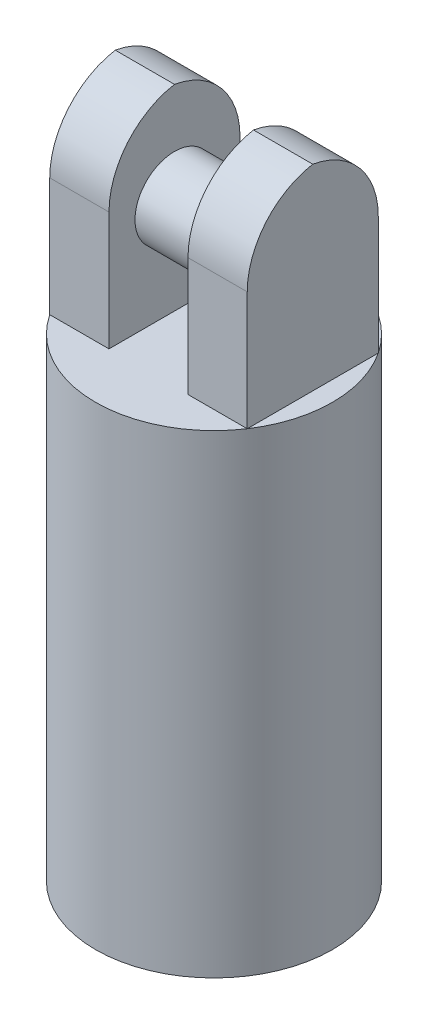
ISO-10303-21;
HEADER;
FILE_DESCRIPTION(('STEP AP214'),'2;1');
FILE_NAME('part.step','',(''),(''),'','','');
FILE_SCHEMA(('AUTOMOTIVE_DESIGN { 1 0 10303 214 1 1 1 1 }'));
ENDSEC;
DATA;
#1=APPLICATION_CONTEXT('core data for automotive mechanical design processes');
#2=APPLICATION_PROTOCOL_DEFINITION('international standard','automotive_design',2000,#1);
#3=PRODUCT_CONTEXT('',#1,'mechanical');
#4=PRODUCT('Part','Part','',(#3));
#5=PRODUCT_RELATED_PRODUCT_CATEGORY('part','',(#4));
#6=PRODUCT_DEFINITION_FORMATION('','',#4);
#7=PRODUCT_DEFINITION_CONTEXT('part definition',#1,'design');
#8=PRODUCT_DEFINITION('design','',#6,#7);
#9=PRODUCT_DEFINITION_SHAPE('','',#8);
#10=(LENGTH_UNIT() NAMED_UNIT(*) SI_UNIT(.MILLI.,.METRE.));
#11=(NAMED_UNIT(*) PLANE_ANGLE_UNIT() SI_UNIT($,.RADIAN.));
#12=(NAMED_UNIT(*) SI_UNIT($,.STERADIAN.) SOLID_ANGLE_UNIT());
#13=UNCERTAINTY_MEASURE_WITH_UNIT(LENGTH_MEASURE(1.E-05),#10,'distance_accuracy_value','');
#14=(GEOMETRIC_REPRESENTATION_CONTEXT(3) GLOBAL_UNCERTAINTY_ASSIGNED_CONTEXT((#13)) GLOBAL_UNIT_ASSIGNED_CONTEXT((#10,
#11,#12)) REPRESENTATION_CONTEXT('',''));
#15=CARTESIAN_POINT('',(0.,0.,0.));
#16=DIRECTION('',(0.,0.,1.));
#17=DIRECTION('',(1.,0.,0.));
#18=AXIS2_PLACEMENT_3D('',#15,#16,#17);
#19=CARTESIAN_POINT('',(-31.75,215.9,-21.0605674187568));
#20=DIRECTION('',(0.,0.,1.));
#21=DIRECTION('',(1.,0.,0.));
#22=AXIS2_PLACEMENT_3D('',#19,#20,#21);
#23=PLANE('',#22);
#24=DIRECTION('',(0.,1.,0.));
#25=VECTOR('',#24,1.);
#26=CARTESIAN_POINT('',(12.7,152.4,-21.0605674187568));
#27=LINE('',#26,#25);
#28=CARTESIAN_POINT('',(12.7,152.4,-21.0605674187568));
#29=VERTEX_POINT('',#28);
#30=CARTESIAN_POINT('',(12.7,190.5,-21.0605674187568));
#31=VERTEX_POINT('',#30);
#32=EDGE_CURVE('E120',#29,#31,#27,.T.);
#33=ORIENTED_EDGE('',*,*,#32,.T.);
#34=DIRECTION('',(-1.,0.,0.));
#35=VECTOR('',#34,1.);
#36=CARTESIAN_POINT('',(-31.75,190.5,-21.0605674187568));
#37=LINE('',#36,#35);
#38=CARTESIAN_POINT('',(31.75,190.5,-21.0605674187568));
#39=VERTEX_POINT('',#38);
#40=EDGE_CURVE('E211',#31,#39,#37,.F.);
#41=ORIENTED_EDGE('',*,*,#40,.T.);
#42=DIRECTION('',(0.,-1.,0.));
#43=VECTOR('',#42,1.);
#44=CARTESIAN_POINT('',(31.75,215.9,-21.0605674187568));
#45=LINE('',#44,#43);
#46=CARTESIAN_POINT('',(31.75,152.4,-21.0605674187568));
#47=VERTEX_POINT('',#46);
#48=EDGE_CURVE('E149',#39,#47,#45,.T.);
#49=ORIENTED_EDGE('',*,*,#48,.T.);
#50=DIRECTION('',(-1.,0.,0.));
#51=VECTOR('',#50,1.);
#52=CARTESIAN_POINT('',(-31.75,152.4,-21.0605674187568));
#53=LINE('',#52,#51);
#54=EDGE_CURVE('E141',#47,#29,#53,.T.);
#55=ORIENTED_EDGE('',*,*,#54,.T.);
#56=EDGE_LOOP('',(#33,#41,#49,#55));
#57=FACE_BOUND('',#56,.T.);
#58=ADVANCED_FACE('F45',(#57),#23,.F.);
#59=CARTESIAN_POINT('',(-31.75,215.9,21.0605674187568));
#60=DIRECTION('',(0.,0.,-1.));
#61=DIRECTION('',(-1.,0.,0.));
#62=AXIS2_PLACEMENT_3D('',#59,#60,#61);
#63=PLANE('',#62);
#64=DIRECTION('',(0.,-1.,0.));
#65=VECTOR('',#64,1.);
#66=CARTESIAN_POINT('',(31.75,215.9,21.0605674187568));
#67=LINE('',#66,#65);
#68=CARTESIAN_POINT('',(31.75,190.5,21.0605674187568));
#69=VERTEX_POINT('',#68);
#70=CARTESIAN_POINT('',(31.75,152.4,21.0605674187568));
#71=VERTEX_POINT('',#70);
#72=EDGE_CURVE('E166',#69,#71,#67,.T.);
#73=ORIENTED_EDGE('',*,*,#72,.F.);
#74=DIRECTION('',(1.,0.,0.));
#75=VECTOR('',#74,1.);
#76=CARTESIAN_POINT('',(-31.75,190.5,21.0605674187568));
#77=LINE('',#76,#75);
#78=CARTESIAN_POINT('',(12.7,190.5,21.0605674187568));
#79=VERTEX_POINT('',#78);
#80=EDGE_CURVE('E11',#69,#79,#77,.F.);
#81=ORIENTED_EDGE('',*,*,#80,.T.);
#82=DIRECTION('',(0.,1.,0.));
#83=VECTOR('',#82,1.);
#84=CARTESIAN_POINT('',(12.7,152.4,21.0605674187568));
#85=LINE('',#84,#83);
#86=CARTESIAN_POINT('',(12.7,152.4,21.0605674187568));
#87=VERTEX_POINT('',#86);
#88=EDGE_CURVE('E241',#87,#79,#85,.T.);
#89=ORIENTED_EDGE('',*,*,#88,.F.);
#90=DIRECTION('',(1.,0.,0.));
#91=VECTOR('',#90,1.);
#92=CARTESIAN_POINT('',(-31.75,152.4,21.0605674187568));
#93=LINE('',#92,#91);
#94=EDGE_CURVE('E145',#87,#71,#93,.T.);
#95=ORIENTED_EDGE('',*,*,#94,.T.);
#96=EDGE_LOOP('',(#73,#81,#89,#95));
#97=FACE_BOUND('',#96,.T.);
#98=ADVANCED_FACE('F295',(#97),#63,.F.);
#99=CARTESIAN_POINT('',(0.,152.4,0.));
#100=DIRECTION('',(0.,1.,0.));
#101=DIRECTION('',(0.,0.,1.));
#102=AXIS2_PLACEMENT_3D('',#99,#100,#101);
#103=PLANE('',#102);
#104=DIRECTION('',(0.,0.,-1.));
#105=VECTOR('',#104,1.);
#106=CARTESIAN_POINT('',(31.75,152.4,21.0605674187568));
#107=LINE('',#106,#105);
#108=EDGE_CURVE('E159',#71,#47,#107,.T.);
#109=ORIENTED_EDGE('',*,*,#108,.F.);
#110=CARTESIAN_POINT('',(0.,152.4,0.));
#111=DIRECTION('',(0.,1.,0.));
#112=DIRECTION('',(0.,0.,1.));
#113=AXIS2_PLACEMENT_3D('',#110,#111,#112);
#114=CIRCLE('',#113,38.1);
#115=EDGE_CURVE('E178',#71,#47,#114,.T.);
#116=ORIENTED_EDGE('',*,*,#115,.T.);
#117=EDGE_LOOP('',(#109,#116));
#118=FACE_BOUND('',#117,.T.);
#119=ADVANCED_FACE('F290',(#118),#103,.T.);
#120=DIRECTION('',(0.,0.,1.));
#121=VECTOR('',#120,1.);
#122=CARTESIAN_POINT('',(-31.75,152.4,21.0605674187568));
#123=LINE('',#122,#121);
#124=CARTESIAN_POINT('',(-31.75,152.4,-21.0605674187568));
#125=VERTEX_POINT('',#124);
#126=CARTESIAN_POINT('',(-31.75,152.4,21.0605674187568));
#127=VERTEX_POINT('',#126);
#128=EDGE_CURVE('E151',#125,#127,#123,.T.);
#129=ORIENTED_EDGE('',*,*,#128,.F.);
#130=EDGE_CURVE('E264',#125,#127,#114,.T.);
#131=ORIENTED_EDGE('',*,*,#130,.T.);
#132=EDGE_LOOP('',(#129,#131));
#133=FACE_BOUND('',#132,.T.);
#134=ADVANCED_FACE('F272',(#133),#103,.T.);
#135=CARTESIAN_POINT('',(0.,152.4,0.));
#136=DIRECTION('',(0.,-1.,0.));
#137=DIRECTION('',(0.,0.,-1.));
#138=AXIS2_PLACEMENT_3D('',#135,#136,#137);
#139=CYLINDRICAL_SURFACE('',#138,38.1);
#140=ORIENTED_EDGE('',*,*,#115,.F.);
#141=EDGE_CURVE('E184',#127,#71,#114,.T.);
#142=ORIENTED_EDGE('',*,*,#141,.F.);
#143=ORIENTED_EDGE('',*,*,#130,.F.);
#144=EDGE_CURVE('E183',#47,#125,#114,.T.);
#145=ORIENTED_EDGE('',*,*,#144,.F.);
#146=EDGE_LOOP('',(#140,#142,#143,#145));
#147=FACE_BOUND('',#146,.T.);
#148=CARTESIAN_POINT('',(0.,0.,0.));
#149=DIRECTION('',(0.,1.,0.));
#150=DIRECTION('',(0.,0.,1.));
#151=AXIS2_PLACEMENT_3D('',#148,#149,#150);
#152=CIRCLE('',#151,38.1);
#153=CARTESIAN_POINT('',(0.,0.,38.1));
#154=VERTEX_POINT('',#153);
#155=EDGE_CURVE('E177',#154,#154,#152,.T.);
#156=ORIENTED_EDGE('',*,*,#155,.T.);
#157=EDGE_LOOP('',(#156));
#158=FACE_BOUND('',#157,.T.);
#159=ADVANCED_FACE('F268',(#147,#158),#139,.T.);
#160=ORIENTED_EDGE('',*,*,#54,.F.);
#161=ORIENTED_EDGE('',*,*,#144,.T.);
#162=CARTESIAN_POINT('',(-12.7,152.4,-21.0605674187568));
#163=VERTEX_POINT('',#162);
#164=EDGE_CURVE('E152',#163,#125,#53,.T.);
#165=ORIENTED_EDGE('',*,*,#164,.F.);
#166=DIRECTION('',(0.,0.,1.));
#167=VECTOR('',#166,1.);
#168=CARTESIAN_POINT('',(-12.7,152.4,21.0605674187568));
#169=LINE('',#168,#167);
#170=CARTESIAN_POINT('',(-12.7,152.4,21.0605674187568));
#171=VERTEX_POINT('',#170);
#172=EDGE_CURVE('E134',#163,#171,#169,.T.);
#173=ORIENTED_EDGE('',*,*,#172,.T.);
#174=EDGE_CURVE('E162',#127,#171,#93,.T.);
#175=ORIENTED_EDGE('',*,*,#174,.F.);
#176=ORIENTED_EDGE('',*,*,#141,.T.);
#177=ORIENTED_EDGE('',*,*,#94,.F.);
#178=DIRECTION('',(0.,0.,-1.));
#179=VECTOR('',#178,1.);
#180=CARTESIAN_POINT('',(12.7,152.4,21.0605674187568));
#181=LINE('',#180,#179);
#182=EDGE_CURVE('E124',#87,#29,#181,.T.);
#183=ORIENTED_EDGE('',*,*,#182,.T.);
#184=EDGE_LOOP('',(#160,#161,#165,#173,#175,#176,#177,#183));
#185=FACE_BOUND('',#184,.T.);
#186=ADVANCED_FACE('F139',(#185),#103,.T.);
#187=CARTESIAN_POINT('',(0.,0.,0.));
#188=DIRECTION('',(0.,1.,0.));
#189=DIRECTION('',(0.,0.,1.));
#190=AXIS2_PLACEMENT_3D('',#187,#188,#189);
#191=PLANE('',#190);
#192=CARTESIAN_POINT('',(0.,0.,0.));
#193=DIRECTION('',(0.,-1.,0.));
#194=DIRECTION('',(0.,0.,-1.));
#195=AXIS2_PLACEMENT_3D('',#192,#193,#194);
#196=CIRCLE('',#195,25.4);
#197=CARTESIAN_POINT('',(0.,0.,-25.4));
#198=VERTEX_POINT('',#197);
#199=EDGE_CURVE('E228',#198,#198,#196,.T.);
#200=ORIENTED_EDGE('',*,*,#199,.F.);
#201=EDGE_LOOP('',(#200));
#202=FACE_BOUND('',#201,.T.);
#203=ORIENTED_EDGE('',*,*,#155,.F.);
#204=EDGE_LOOP('',(#203));
#205=FACE_BOUND('',#204,.T.);
#206=ADVANCED_FACE('F325',(#202,#205),#191,.F.);
#207=CARTESIAN_POINT('',(31.75,215.9,21.0605674187568));
#208=DIRECTION('',(-1.,0.,0.));
#209=DIRECTION('',(0.,0.,1.));
#210=AXIS2_PLACEMENT_3D('',#207,#208,#209);
#211=PLANE('',#210);
#212=ORIENTED_EDGE('',*,*,#48,.F.);
#213=CARTESIAN_POINT('',(31.75,190.5,4.3394325812432));
#214=DIRECTION('',(-1.,0.,0.));
#215=DIRECTION('',(0.,0.,1.));
#216=AXIS2_PLACEMENT_3D('',#213,#214,#215);
#217=CIRCLE('',#216,25.4);
#218=CARTESIAN_POINT('',(31.75,215.526572375634,0.));
#219=VERTEX_POINT('',#218);
#220=EDGE_CURVE('E55',#39,#219,#217,.F.);
#221=ORIENTED_EDGE('',*,*,#220,.T.);
#222=CARTESIAN_POINT('',(31.75,190.5,-4.3394325812432));
#223=DIRECTION('',(-1.,0.,0.));
#224=DIRECTION('',(0.,0.,1.));
#225=AXIS2_PLACEMENT_3D('',#222,#223,#224);
#226=CIRCLE('',#225,25.4);
#227=EDGE_CURVE('E66',#219,#69,#226,.F.);
#228=ORIENTED_EDGE('',*,*,#227,.T.);
#229=ORIENTED_EDGE('',*,*,#72,.T.);
#230=ORIENTED_EDGE('',*,*,#108,.T.);
#231=EDGE_LOOP('',(#212,#221,#228,#229,#230));
#232=FACE_BOUND('',#231,.T.);
#233=ADVANCED_FACE('F291',(#232),#211,.F.);
#234=DIRECTION('',(0.,-1.,0.));
#235=VECTOR('',#234,1.);
#236=CARTESIAN_POINT('',(-31.75,215.9,-21.0605674187568));
#237=LINE('',#236,#235);
#238=CARTESIAN_POINT('',(-31.75,190.5,-21.0605674187568));
#239=VERTEX_POINT('',#238);
#240=EDGE_CURVE('E172',#239,#125,#237,.T.);
#241=ORIENTED_EDGE('',*,*,#240,.F.);
#242=DIRECTION('',(-1.,0.,0.));
#243=VECTOR('',#242,1.);
#244=CARTESIAN_POINT('',(-31.75,190.5,-21.0605674187568));
#245=LINE('',#244,#243);
#246=CARTESIAN_POINT('',(-12.7,190.5,-21.0605674187568));
#247=VERTEX_POINT('',#246);
#248=EDGE_CURVE('E193',#239,#247,#245,.F.);
#249=ORIENTED_EDGE('',*,*,#248,.T.);
#250=DIRECTION('',(0.,1.,0.));
#251=VECTOR('',#250,1.);
#252=CARTESIAN_POINT('',(-12.7,152.4,-21.0605674187568));
#253=LINE('',#252,#251);
#254=EDGE_CURVE('E133',#163,#247,#253,.T.);
#255=ORIENTED_EDGE('',*,*,#254,.F.);
#256=ORIENTED_EDGE('',*,*,#164,.T.);
#257=EDGE_LOOP('',(#241,#249,#255,#256));
#258=FACE_BOUND('',#257,.T.);
#259=ADVANCED_FACE('F257',(#258),#23,.F.);
#260=CARTESIAN_POINT('',(-31.75,215.9,21.0605674187568));
#261=DIRECTION('',(1.,0.,0.));
#262=DIRECTION('',(0.,0.,-1.));
#263=AXIS2_PLACEMENT_3D('',#260,#261,#262);
#264=PLANE('',#263);
#265=CARTESIAN_POINT('',(-31.75,190.5,-4.3394325812432));
#266=DIRECTION('',(1.,0.,0.));
#267=DIRECTION('',(0.,0.,-1.));
#268=AXIS2_PLACEMENT_3D('',#265,#266,#267);
#269=CIRCLE('',#268,25.4);
#270=CARTESIAN_POINT('',(-31.75,190.5,21.0605674187568));
#271=VERTEX_POINT('',#270);
#272=CARTESIAN_POINT('',(-31.75,215.526572375634,0.));
#273=VERTEX_POINT('',#272);
#274=EDGE_CURVE('E182',#271,#273,#269,.F.);
#275=ORIENTED_EDGE('',*,*,#274,.T.);
#276=CARTESIAN_POINT('',(-31.75,190.5,4.3394325812432));
#277=DIRECTION('',(1.,0.,0.));
#278=DIRECTION('',(0.,0.,-1.));
#279=AXIS2_PLACEMENT_3D('',#276,#277,#278);
#280=CIRCLE('',#279,25.4);
#281=EDGE_CURVE('E190',#273,#239,#280,.F.);
#282=ORIENTED_EDGE('',*,*,#281,.T.);
#283=ORIENTED_EDGE('',*,*,#240,.T.);
#284=ORIENTED_EDGE('',*,*,#128,.T.);
#285=DIRECTION('',(0.,-1.,0.));
#286=VECTOR('',#285,1.);
#287=CARTESIAN_POINT('',(-31.75,215.9,21.0605674187568));
#288=LINE('',#287,#286);
#289=EDGE_CURVE('E169',#271,#127,#288,.T.);
#290=ORIENTED_EDGE('',*,*,#289,.F.);
#291=EDGE_LOOP('',(#275,#282,#283,#284,#290));
#292=FACE_BOUND('',#291,.T.);
#293=ADVANCED_FACE('F275',(#292),#264,.F.);
#294=DIRECTION('',(0.,1.,0.));
#295=VECTOR('',#294,1.);
#296=CARTESIAN_POINT('',(-12.7,152.4,21.0605674187568));
#297=LINE('',#296,#295);
#298=CARTESIAN_POINT('',(-12.7,190.5,21.0605674187568));
#299=VERTEX_POINT('',#298);
#300=EDGE_CURVE('E244',#171,#299,#297,.T.);
#301=ORIENTED_EDGE('',*,*,#300,.T.);
#302=DIRECTION('',(1.,0.,0.));
#303=VECTOR('',#302,1.);
#304=CARTESIAN_POINT('',(-31.75,190.5,21.0605674187568));
#305=LINE('',#304,#303);
#306=EDGE_CURVE('E203',#299,#271,#305,.F.);
#307=ORIENTED_EDGE('',*,*,#306,.T.);
#308=ORIENTED_EDGE('',*,*,#289,.T.);
#309=ORIENTED_EDGE('',*,*,#174,.T.);
#310=EDGE_LOOP('',(#301,#307,#308,#309));
#311=FACE_BOUND('',#310,.T.);
#312=ADVANCED_FACE('F285',(#311),#63,.F.);
#313=CARTESIAN_POINT('',(12.7,152.4,21.0605674187568));
#314=DIRECTION('',(1.,0.,0.));
#315=DIRECTION('',(0.,0.,-1.));
#316=AXIS2_PLACEMENT_3D('',#313,#314,#315);
#317=PLANE('',#316);
#318=CARTESIAN_POINT('',(12.7,184.15,0.));
#319=DIRECTION('',(1.,0.,0.));
#320=DIRECTION('',(0.,0.,-1.));
#321=AXIS2_PLACEMENT_3D('',#318,#319,#320);
#322=CIRCLE('',#321,12.7);
#323=CARTESIAN_POINT('',(12.7,184.15,-12.7));
#324=VERTEX_POINT('',#323);
#325=EDGE_CURVE('E234',#324,#324,#322,.T.);
#326=ORIENTED_EDGE('',*,*,#325,.T.);
#327=EDGE_LOOP('',(#326));
#328=FACE_BOUND('',#327,.T.);
#329=CARTESIAN_POINT('',(12.7,190.5,-4.3394325812432));
#330=DIRECTION('',(1.,0.,0.));
#331=DIRECTION('',(0.,0.,-1.));
#332=AXIS2_PLACEMENT_3D('',#329,#330,#331);
#333=CIRCLE('',#332,25.4);
#334=CARTESIAN_POINT('',(12.7,215.526572375634,0.));
#335=VERTEX_POINT('',#334);
#336=EDGE_CURVE('E206',#79,#335,#333,.F.);
#337=ORIENTED_EDGE('',*,*,#336,.T.);
#338=CARTESIAN_POINT('',(12.7,190.5,4.3394325812432));
#339=DIRECTION('',(1.,0.,0.));
#340=DIRECTION('',(0.,0.,-1.));
#341=AXIS2_PLACEMENT_3D('',#338,#339,#340);
#342=CIRCLE('',#341,25.4);
#343=EDGE_CURVE('E127',#335,#31,#342,.F.);
#344=ORIENTED_EDGE('',*,*,#343,.T.);
#345=ORIENTED_EDGE('',*,*,#32,.F.);
#346=ORIENTED_EDGE('',*,*,#182,.F.);
#347=ORIENTED_EDGE('',*,*,#88,.T.);
#348=EDGE_LOOP('',(#337,#344,#345,#346,#347));
#349=FACE_BOUND('',#348,.T.);
#350=ADVANCED_FACE('F122',(#328,#349),#317,.F.);
#351=CARTESIAN_POINT('',(-12.7,152.4,21.0605674187568));
#352=DIRECTION('',(-1.,0.,0.));
#353=DIRECTION('',(0.,0.,1.));
#354=AXIS2_PLACEMENT_3D('',#351,#352,#353);
#355=PLANE('',#354);
#356=CARTESIAN_POINT('',(-12.7,184.15,0.));
#357=DIRECTION('',(-1.,0.,0.));
#358=DIRECTION('',(0.,0.,1.));
#359=AXIS2_PLACEMENT_3D('',#356,#357,#358);
#360=CIRCLE('',#359,12.7);
#361=CARTESIAN_POINT('',(-12.7,184.15,12.7));
#362=VERTEX_POINT('',#361);
#363=EDGE_CURVE('E49',#362,#362,#360,.T.);
#364=ORIENTED_EDGE('',*,*,#363,.T.);
#365=EDGE_LOOP('',(#364));
#366=FACE_BOUND('',#365,.T.);
#367=ORIENTED_EDGE('',*,*,#254,.T.);
#368=CARTESIAN_POINT('',(-12.7,190.5,4.3394325812432));
#369=DIRECTION('',(-1.,0.,0.));
#370=DIRECTION('',(0.,0.,1.));
#371=AXIS2_PLACEMENT_3D('',#368,#369,#370);
#372=CIRCLE('',#371,25.4);
#373=CARTESIAN_POINT('',(-12.7,215.526572375634,0.));
#374=VERTEX_POINT('',#373);
#375=EDGE_CURVE('E200',#247,#374,#372,.F.);
#376=ORIENTED_EDGE('',*,*,#375,.T.);
#377=CARTESIAN_POINT('',(-12.7,190.5,-4.3394325812432));
#378=DIRECTION('',(-1.,0.,0.));
#379=DIRECTION('',(0.,0.,1.));
#380=AXIS2_PLACEMENT_3D('',#377,#378,#379);
#381=CIRCLE('',#380,25.4);
#382=EDGE_CURVE('E197',#374,#299,#381,.F.);
#383=ORIENTED_EDGE('',*,*,#382,.T.);
#384=ORIENTED_EDGE('',*,*,#300,.F.);
#385=ORIENTED_EDGE('',*,*,#172,.F.);
#386=EDGE_LOOP('',(#367,#376,#383,#384,#385));
#387=FACE_BOUND('',#386,.T.);
#388=ADVANCED_FACE('F252',(#366,#387),#355,.F.);
#389=CARTESIAN_POINT('',(0.,190.5,-4.3394325812432));
#390=DIRECTION('',(1.,0.,0.));
#391=DIRECTION('',(0.,0.,-1.));
#392=AXIS2_PLACEMENT_3D('',#389,#390,#391);
#393=CYLINDRICAL_SURFACE('',#392,25.4);
#394=ORIENTED_EDGE('',*,*,#306,.F.);
#395=ORIENTED_EDGE('',*,*,#382,.F.);
#396=DIRECTION('',(1.,0.,0.));
#397=VECTOR('',#396,1.);
#398=CARTESIAN_POINT('',(-22.225,215.526572375634,0.));
#399=LINE('',#398,#397);
#400=EDGE_CURVE('E147',#273,#374,#399,.T.);
#401=ORIENTED_EDGE('',*,*,#400,.F.);
#402=ORIENTED_EDGE('',*,*,#274,.F.);
#403=EDGE_LOOP('',(#394,#395,#401,#402));
#404=FACE_BOUND('',#403,.T.);
#405=ADVANCED_FACE('F283',(#404),#393,.T.);
#406=CARTESIAN_POINT('',(0.,190.5,4.3394325812432));
#407=DIRECTION('',(-1.,0.,0.));
#408=DIRECTION('',(0.,0.,1.));
#409=AXIS2_PLACEMENT_3D('',#406,#407,#408);
#410=CYLINDRICAL_SURFACE('',#409,25.4);
#411=ORIENTED_EDGE('',*,*,#375,.F.);
#412=ORIENTED_EDGE('',*,*,#248,.F.);
#413=ORIENTED_EDGE('',*,*,#281,.F.);
#414=ORIENTED_EDGE('',*,*,#400,.T.);
#415=EDGE_LOOP('',(#411,#412,#413,#414));
#416=FACE_BOUND('',#415,.T.);
#417=ADVANCED_FACE('F279',(#416),#410,.T.);
#418=CARTESIAN_POINT('',(0.,190.5,-4.3394325812432));
#419=DIRECTION('',(1.,0.,0.));
#420=DIRECTION('',(0.,0.,-1.));
#421=AXIS2_PLACEMENT_3D('',#418,#419,#420);
#422=CYLINDRICAL_SURFACE('',#421,25.4);
#423=ORIENTED_EDGE('',*,*,#80,.F.);
#424=ORIENTED_EDGE('',*,*,#227,.F.);
#425=DIRECTION('',(1.,0.,0.));
#426=VECTOR('',#425,1.);
#427=CARTESIAN_POINT('',(22.225,215.526572375634,0.));
#428=LINE('',#427,#426);
#429=EDGE_CURVE('E220',#335,#219,#428,.T.);
#430=ORIENTED_EDGE('',*,*,#429,.F.);
#431=ORIENTED_EDGE('',*,*,#336,.F.);
#432=EDGE_LOOP('',(#423,#424,#430,#431));
#433=FACE_BOUND('',#432,.T.);
#434=ADVANCED_FACE('F47',(#433),#422,.T.);
#435=CARTESIAN_POINT('',(0.,190.5,4.3394325812432));
#436=DIRECTION('',(-1.,0.,0.));
#437=DIRECTION('',(0.,0.,1.));
#438=AXIS2_PLACEMENT_3D('',#435,#436,#437);
#439=CYLINDRICAL_SURFACE('',#438,25.4);
#440=ORIENTED_EDGE('',*,*,#220,.F.);
#441=ORIENTED_EDGE('',*,*,#40,.F.);
#442=ORIENTED_EDGE('',*,*,#343,.F.);
#443=ORIENTED_EDGE('',*,*,#429,.T.);
#444=EDGE_LOOP('',(#440,#441,#442,#443));
#445=FACE_BOUND('',#444,.T.);
#446=ADVANCED_FACE('F299',(#445),#439,.T.);
#447=CARTESIAN_POINT('',(0.,50.8,0.));
#448=DIRECTION('',(0.,-1.,0.));
#449=DIRECTION('',(0.,0.,-1.));
#450=AXIS2_PLACEMENT_3D('',#447,#448,#449);
#451=CYLINDRICAL_SURFACE('',#450,25.4);
#452=CARTESIAN_POINT('',(0.,50.8,0.));
#453=DIRECTION('',(0.,-1.,0.));
#454=DIRECTION('',(0.,0.,-1.));
#455=AXIS2_PLACEMENT_3D('',#452,#453,#454);
#456=CIRCLE('',#455,25.4);
#457=CARTESIAN_POINT('',(0.,50.8,-25.4));
#458=VERTEX_POINT('',#457);
#459=EDGE_CURVE('E223',#458,#458,#456,.T.);
#460=ORIENTED_EDGE('',*,*,#459,.F.);
#461=EDGE_LOOP('',(#460));
#462=FACE_BOUND('',#461,.T.);
#463=ORIENTED_EDGE('',*,*,#199,.T.);
#464=EDGE_LOOP('',(#463));
#465=FACE_BOUND('',#464,.T.);
#466=ADVANCED_FACE('F301',(#462,#465),#451,.F.);
#467=CARTESIAN_POINT('',(0.,50.8,0.));
#468=DIRECTION('',(0.,-1.,0.));
#469=DIRECTION('',(0.,0.,-1.));
#470=AXIS2_PLACEMENT_3D('',#467,#468,#469);
#471=PLANE('',#470);
#472=ORIENTED_EDGE('',*,*,#459,.T.);
#473=EDGE_LOOP('',(#472));
#474=FACE_BOUND('',#473,.T.);
#475=ADVANCED_FACE('F307',(#474),#471,.T.);
#476=CARTESIAN_POINT('',(-20.828,184.15,0.));
#477=DIRECTION('',(1.,0.,0.));
#478=DIRECTION('',(0.,0.,-1.));
#479=AXIS2_PLACEMENT_3D('',#476,#477,#478);
#480=CYLINDRICAL_SURFACE('',#479,12.7);
#481=ORIENTED_EDGE('',*,*,#363,.F.);
#482=EDGE_LOOP('',(#481));
#483=FACE_BOUND('',#482,.T.);
#484=ORIENTED_EDGE('',*,*,#325,.F.);
#485=EDGE_LOOP('',(#484));
#486=FACE_BOUND('',#485,.T.);
#487=ADVANCED_FACE('F450',(#483,#486),#480,.T.);
#488=CLOSED_SHELL('',(#58,#98,#119,#134,#159,#186,#206,#233,#259,#293,#312,#350,#388,#405,#417,
#434,#446,#466,#475,#487));
#489=MANIFOLD_SOLID_BREP('B2',#488);
#490=ADVANCED_BREP_SHAPE_REPRESENTATION('',(#18,#489),#14);
#491=SHAPE_DEFINITION_REPRESENTATION(#9,#490);
ENDSEC;
END-ISO-10303-21;
